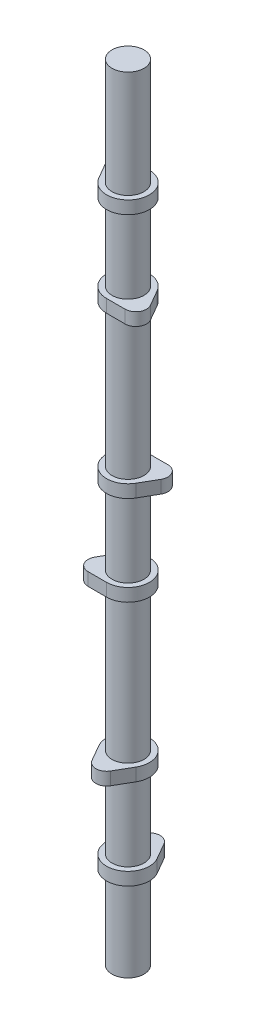
ISO-10303-21;
HEADER;
FILE_DESCRIPTION(('STEP AP214'),'2;1');
FILE_NAME('part.step','',(''),(''),'','','');
FILE_SCHEMA(('AUTOMOTIVE_DESIGN { 1 0 10303 214 1 1 1 1 }'));
ENDSEC;
DATA;
#1=APPLICATION_CONTEXT('core data for automotive mechanical design processes');
#2=APPLICATION_PROTOCOL_DEFINITION('international standard','automotive_design',2000,#1);
#3=PRODUCT_CONTEXT('',#1,'mechanical');
#4=PRODUCT('Part','Part','',(#3));
#5=PRODUCT_RELATED_PRODUCT_CATEGORY('part','',(#4));
#6=PRODUCT_DEFINITION_FORMATION('','',#4);
#7=PRODUCT_DEFINITION_CONTEXT('part definition',#1,'design');
#8=PRODUCT_DEFINITION('design','',#6,#7);
#9=PRODUCT_DEFINITION_SHAPE('','',#8);
#10=(LENGTH_UNIT() NAMED_UNIT(*) SI_UNIT(.MILLI.,.METRE.));
#11=(NAMED_UNIT(*) PLANE_ANGLE_UNIT() SI_UNIT($,.RADIAN.));
#12=(NAMED_UNIT(*) SI_UNIT($,.STERADIAN.) SOLID_ANGLE_UNIT());
#13=UNCERTAINTY_MEASURE_WITH_UNIT(LENGTH_MEASURE(1.E-05),#10,'distance_accuracy_value','');
#14=(GEOMETRIC_REPRESENTATION_CONTEXT(3) GLOBAL_UNCERTAINTY_ASSIGNED_CONTEXT((#13)) GLOBAL_UNIT_ASSIGNED_CONTEXT((#10,
#11,#12)) REPRESENTATION_CONTEXT('',''));
#15=CARTESIAN_POINT('',(0.,0.,0.));
#16=DIRECTION('',(0.,0.,1.));
#17=DIRECTION('',(1.,0.,0.));
#18=AXIS2_PLACEMENT_3D('',#15,#16,#17);
#19=CARTESIAN_POINT('',(0.,416.56,0.));
#20=DIRECTION('',(0.,-1.,0.));
#21=DIRECTION('',(0.,0.,-1.));
#22=AXIS2_PLACEMENT_3D('',#19,#20,#21);
#23=CYLINDRICAL_SURFACE('',#22,9.5);
#24=CARTESIAN_POINT('',(0.,207.01,0.));
#25=DIRECTION('',(0.,1.,0.));
#26=DIRECTION('',(0.,0.,1.));
#27=AXIS2_PLACEMENT_3D('',#24,#25,#26);
#28=CIRCLE('',#27,9.5);
#29=CARTESIAN_POINT('',(0.,207.01,9.5));
#30=VERTEX_POINT('',#29);
#31=EDGE_CURVE('E381',#30,#30,#28,.T.);
#32=ORIENTED_EDGE('',*,*,#31,.T.);
#33=EDGE_LOOP('',(#32));
#34=FACE_BOUND('',#33,.T.);
#35=CARTESIAN_POINT('',(0.,292.1,0.));
#36=DIRECTION('',(0.,1.,0.));
#37=DIRECTION('',(0.,0.,1.));
#38=AXIS2_PLACEMENT_3D('',#35,#36,#37);
#39=CIRCLE('',#38,9.5);
#40=CARTESIAN_POINT('',(0.,292.1,9.5));
#41=VERTEX_POINT('',#40);
#42=EDGE_CURVE('E11',#41,#41,#39,.T.);
#43=ORIENTED_EDGE('',*,*,#42,.F.);
#44=EDGE_LOOP('',(#43));
#45=FACE_BOUND('',#44,.T.);
#46=ADVANCED_FACE('F43',(#34,#45),#23,.T.);
#47=CARTESIAN_POINT('',(0.,60.96,0.));
#48=DIRECTION('',(0.,1.,0.));
#49=DIRECTION('',(0.,0.,1.));
#50=AXIS2_PLACEMENT_3D('',#47,#48,#49);
#51=CIRCLE('',#50,9.5);
#52=CARTESIAN_POINT('',(0.,60.96,9.5));
#53=VERTEX_POINT('',#52);
#54=EDGE_CURVE('E424',#53,#53,#51,.T.);
#55=ORIENTED_EDGE('',*,*,#54,.T.);
#56=EDGE_LOOP('',(#55));
#57=FACE_BOUND('',#56,.T.);
#58=CARTESIAN_POINT('',(0.,146.05,0.));
#59=DIRECTION('',(0.,1.,0.));
#60=DIRECTION('',(0.,0.,1.));
#61=AXIS2_PLACEMENT_3D('',#58,#59,#60);
#62=CIRCLE('',#61,9.5);
#63=CARTESIAN_POINT('',(0.,146.05,9.5));
#64=VERTEX_POINT('',#63);
#65=EDGE_CURVE('E485',#64,#64,#62,.T.);
#66=ORIENTED_EDGE('',*,*,#65,.F.);
#67=EDGE_LOOP('',(#66));
#68=FACE_BOUND('',#67,.T.);
#69=ADVANCED_FACE('F539',(#57,#68),#23,.T.);
#70=CARTESIAN_POINT('',(0.,7.62000000000002,0.));
#71=DIRECTION('',(0.,1.,0.));
#72=DIRECTION('',(0.,0.,1.));
#73=AXIS2_PLACEMENT_3D('',#70,#71,#72);
#74=CIRCLE('',#73,9.5);
#75=CARTESIAN_POINT('',(0.,7.62000000000002,9.5));
#76=VERTEX_POINT('',#75);
#77=EDGE_CURVE('E429',#76,#76,#74,.F.);
#78=ORIENTED_EDGE('',*,*,#77,.F.);
#79=EDGE_LOOP('',(#78));
#80=FACE_BOUND('',#79,.T.);
#81=CARTESIAN_POINT('',(0.,53.34,0.));
#82=DIRECTION('',(0.,1.,0.));
#83=DIRECTION('',(0.,0.,1.));
#84=AXIS2_PLACEMENT_3D('',#81,#82,#83);
#85=CIRCLE('',#84,9.5);
#86=CARTESIAN_POINT('',(0.,53.34,9.5));
#87=VERTEX_POINT('',#86);
#88=EDGE_CURVE('E474',#87,#87,#85,.T.);
#89=ORIENTED_EDGE('',*,*,#88,.F.);
#90=EDGE_LOOP('',(#89));
#91=FACE_BOUND('',#90,.T.);
#92=ADVANCED_FACE('F547',(#80,#91),#23,.T.);
#93=CARTESIAN_POINT('',(0.,7.62,-12.7));
#94=DIRECTION('',(0.,-1.,0.));
#95=DIRECTION('',(0.,0.,-1.));
#96=AXIS2_PLACEMENT_3D('',#93,#94,#95);
#97=CYLINDRICAL_SURFACE('',#96,6.35);
#98=CARTESIAN_POINT('',(0.,0.,-12.7));
#99=DIRECTION('',(0.,1.,0.));
#100=DIRECTION('',(0.,0.,1.));
#101=AXIS2_PLACEMENT_3D('',#98,#99,#100);
#102=CIRCLE('',#101,6.35);
#103=CARTESIAN_POINT('',(5.49926131403118,0.,-15.875));
#104=VERTEX_POINT('',#103);
#105=CARTESIAN_POINT('',(-5.49926131403118,0.,-15.875));
#106=VERTEX_POINT('',#105);
#107=EDGE_CURVE('E437',#104,#106,#102,.T.);
#108=ORIENTED_EDGE('',*,*,#107,.T.);
#109=DIRECTION('',(0.,-1.,0.));
#110=VECTOR('',#109,1.);
#111=CARTESIAN_POINT('',(-5.49926131403118,7.62,-15.875));
#112=LINE('',#111,#110);
#113=CARTESIAN_POINT('',(-5.49926131403118,7.62,-15.875));
#114=VERTEX_POINT('',#113);
#115=EDGE_CURVE('E467',#114,#106,#112,.T.);
#116=ORIENTED_EDGE('',*,*,#115,.F.);
#117=CARTESIAN_POINT('',(0.,7.62,-12.7));
#118=DIRECTION('',(0.,1.,0.));
#119=DIRECTION('',(0.,0.,1.));
#120=AXIS2_PLACEMENT_3D('',#117,#118,#119);
#121=CIRCLE('',#120,6.35);
#122=CARTESIAN_POINT('',(5.49926131403118,7.62,-15.875));
#123=VERTEX_POINT('',#122);
#124=EDGE_CURVE('E438',#123,#114,#121,.T.);
#125=ORIENTED_EDGE('',*,*,#124,.F.);
#126=DIRECTION('',(0.,-1.,0.));
#127=VECTOR('',#126,1.);
#128=CARTESIAN_POINT('',(5.49926131403118,7.62,-15.875));
#129=LINE('',#128,#127);
#130=EDGE_CURVE('E448',#123,#104,#129,.T.);
#131=ORIENTED_EDGE('',*,*,#130,.T.);
#132=EDGE_LOOP('',(#108,#116,#125,#131));
#133=FACE_BOUND('',#132,.T.);
#134=ADVANCED_FACE('F45',(#133),#97,.T.);
#135=CARTESIAN_POINT('',(-5.49926131403118,7.62,-15.875));
#136=DIRECTION('',(0.866025403784438,0.,0.5));
#137=DIRECTION('',(0.5,0.,-0.866025403784439));
#138=AXIS2_PLACEMENT_3D('',#135,#136,#137);
#139=PLANE('',#138);
#140=DIRECTION('',(-0.5,0.,0.866025403784438));
#141=VECTOR('',#140,1.);
#142=CARTESIAN_POINT('',(-5.49926131403118,0.,-15.875));
#143=LINE('',#142,#141);
#144=CARTESIAN_POINT('',(-10.9985226280624,0.,-6.35));
#145=VERTEX_POINT('',#144);
#146=EDGE_CURVE('E452',#106,#145,#143,.T.);
#147=ORIENTED_EDGE('',*,*,#146,.T.);
#148=DIRECTION('',(0.,-1.,0.));
#149=VECTOR('',#148,1.);
#150=CARTESIAN_POINT('',(-10.9985226280624,7.62,-6.35));
#151=LINE('',#150,#149);
#152=CARTESIAN_POINT('',(-10.9985226280624,7.62,-6.35));
#153=VERTEX_POINT('',#152);
#154=EDGE_CURVE('E464',#153,#145,#151,.T.);
#155=ORIENTED_EDGE('',*,*,#154,.F.);
#156=DIRECTION('',(-0.5,0.,0.866025403784438));
#157=VECTOR('',#156,1.);
#158=CARTESIAN_POINT('',(-5.49926131403118,7.62,-15.875));
#159=LINE('',#158,#157);
#160=EDGE_CURVE('E94',#114,#153,#159,.T.);
#161=ORIENTED_EDGE('',*,*,#160,.F.);
#162=ORIENTED_EDGE('',*,*,#115,.T.);
#163=EDGE_LOOP('',(#147,#155,#161,#162));
#164=FACE_BOUND('',#163,.T.);
#165=ADVANCED_FACE('F581',(#164),#139,.F.);
#166=CARTESIAN_POINT('',(0.,7.62,0.));
#167=DIRECTION('',(0.,-1.,0.));
#168=DIRECTION('',(0.,0.,-1.));
#169=AXIS2_PLACEMENT_3D('',#166,#167,#168);
#170=CYLINDRICAL_SURFACE('',#169,12.7);
#171=CARTESIAN_POINT('',(0.,0.,0.));
#172=DIRECTION('',(0.,1.,0.));
#173=DIRECTION('',(0.,0.,1.));
#174=AXIS2_PLACEMENT_3D('',#171,#172,#173);
#175=CIRCLE('',#174,12.7);
#176=CARTESIAN_POINT('',(10.9985226280624,0.,-6.35000000000001));
#177=VERTEX_POINT('',#176);
#178=EDGE_CURVE('E80',#145,#177,#175,.T.);
#179=ORIENTED_EDGE('',*,*,#178,.T.);
#180=DIRECTION('',(0.,-1.,0.));
#181=VECTOR('',#180,1.);
#182=CARTESIAN_POINT('',(10.9985226280624,7.62,-6.35000000000001));
#183=LINE('',#182,#181);
#184=CARTESIAN_POINT('',(10.9985226280624,7.62,-6.35000000000001));
#185=VERTEX_POINT('',#184);
#186=EDGE_CURVE('E461',#185,#177,#183,.T.);
#187=ORIENTED_EDGE('',*,*,#186,.F.);
#188=CARTESIAN_POINT('',(0.,7.62,0.));
#189=DIRECTION('',(0.,1.,0.));
#190=DIRECTION('',(0.,0.,1.));
#191=AXIS2_PLACEMENT_3D('',#188,#189,#190);
#192=CIRCLE('',#191,12.7);
#193=EDGE_CURVE('E443',#153,#185,#192,.T.);
#194=ORIENTED_EDGE('',*,*,#193,.F.);
#195=ORIENTED_EDGE('',*,*,#154,.T.);
#196=EDGE_LOOP('',(#179,#187,#194,#195));
#197=FACE_BOUND('',#196,.T.);
#198=ADVANCED_FACE('F1023',(#197),#170,.T.);
#199=CARTESIAN_POINT('',(5.49926131403118,7.62,-15.875));
#200=DIRECTION('',(-0.866025403784438,0.,0.5));
#201=DIRECTION('',(0.5,0.,0.866025403784439));
#202=AXIS2_PLACEMENT_3D('',#199,#200,#201);
#203=PLANE('',#202);
#204=DIRECTION('',(-0.5,0.,-0.866025403784439));
#205=VECTOR('',#204,1.);
#206=CARTESIAN_POINT('',(5.49926131403118,0.,-15.875));
#207=LINE('',#206,#205);
#208=EDGE_CURVE('E86',#177,#104,#207,.T.);
#209=ORIENTED_EDGE('',*,*,#208,.T.);
#210=ORIENTED_EDGE('',*,*,#130,.F.);
#211=DIRECTION('',(-0.5,0.,-0.866025403784439));
#212=VECTOR('',#211,1.);
#213=CARTESIAN_POINT('',(5.49926131403118,7.62,-15.875));
#214=LINE('',#213,#212);
#215=EDGE_CURVE('E62',#185,#123,#214,.T.);
#216=ORIENTED_EDGE('',*,*,#215,.F.);
#217=ORIENTED_EDGE('',*,*,#186,.T.);
#218=EDGE_LOOP('',(#209,#210,#216,#217));
#219=FACE_BOUND('',#218,.T.);
#220=ADVANCED_FACE('F1014',(#219),#203,.F.);
#221=CARTESIAN_POINT('',(0.,7.62,-12.7));
#222=DIRECTION('',(0.,1.,0.));
#223=DIRECTION('',(0.,0.,1.));
#224=AXIS2_PLACEMENT_3D('',#221,#222,#223);
#225=PLANE('',#224);
#226=ORIENTED_EDGE('',*,*,#77,.T.);
#227=EDGE_LOOP('',(#226));
#228=FACE_BOUND('',#227,.T.);
#229=ORIENTED_EDGE('',*,*,#124,.T.);
#230=ORIENTED_EDGE('',*,*,#160,.T.);
#231=ORIENTED_EDGE('',*,*,#193,.T.);
#232=ORIENTED_EDGE('',*,*,#215,.T.);
#233=EDGE_LOOP('',(#229,#230,#231,#232));
#234=FACE_BOUND('',#233,.T.);
#235=ADVANCED_FACE('F1004',(#228,#234),#225,.T.);
#236=CARTESIAN_POINT('',(0.,0.,-12.7));
#237=DIRECTION('',(0.,1.,0.));
#238=DIRECTION('',(0.,0.,1.));
#239=AXIS2_PLACEMENT_3D('',#236,#237,#238);
#240=PLANE('',#239);
#241=CARTESIAN_POINT('',(0.,0.,0.));
#242=DIRECTION('',(0.,1.,0.));
#243=DIRECTION('',(0.,0.,1.));
#244=AXIS2_PLACEMENT_3D('',#241,#242,#243);
#245=CIRCLE('',#244,9.5);
#246=CARTESIAN_POINT('',(0.,0.,9.5));
#247=VERTEX_POINT('',#246);
#248=EDGE_CURVE('E470',#247,#247,#245,.F.);
#249=ORIENTED_EDGE('',*,*,#248,.F.);
#250=EDGE_LOOP('',(#249));
#251=FACE_BOUND('',#250,.T.);
#252=ORIENTED_EDGE('',*,*,#107,.F.);
#253=ORIENTED_EDGE('',*,*,#208,.F.);
#254=ORIENTED_EDGE('',*,*,#178,.F.);
#255=ORIENTED_EDGE('',*,*,#146,.F.);
#256=EDGE_LOOP('',(#252,#253,#254,#255));
#257=FACE_BOUND('',#256,.T.);
#258=ADVANCED_FACE('F573',(#251,#257),#240,.F.);
#259=CARTESIAN_POINT('',(0.,-49.53,0.));
#260=DIRECTION('',(0.,1.,0.));
#261=DIRECTION('',(0.,0.,1.));
#262=AXIS2_PLACEMENT_3D('',#259,#260,#261);
#263=PLANE('',#262);
#264=CARTESIAN_POINT('',(0.,-49.53,0.));
#265=DIRECTION('',(0.,1.,0.));
#266=DIRECTION('',(0.,0.,1.));
#267=AXIS2_PLACEMENT_3D('',#264,#265,#266);
#268=CIRCLE('',#267,9.5);
#269=CARTESIAN_POINT('',(0.,-49.53,9.5));
#270=VERTEX_POINT('',#269);
#271=EDGE_CURVE('E430',#270,#270,#268,.T.);
#272=ORIENTED_EDGE('',*,*,#271,.F.);
#273=EDGE_LOOP('',(#272));
#274=FACE_BOUND('',#273,.T.);
#275=ADVANCED_FACE('F564',(#274),#263,.F.);
#276=ORIENTED_EDGE('',*,*,#271,.T.);
#277=EDGE_LOOP('',(#276));
#278=FACE_BOUND('',#277,.T.);
#279=ORIENTED_EDGE('',*,*,#248,.T.);
#280=EDGE_LOOP('',(#279));
#281=FACE_BOUND('',#280,.T.);
#282=ADVANCED_FACE('F555',(#278,#281),#23,.T.);
#283=CARTESIAN_POINT('',(0.,60.96,12.7));
#284=DIRECTION('',(0.,-1.,0.));
#285=DIRECTION('',(0.,0.,1.));
#286=AXIS2_PLACEMENT_3D('',#283,#284,#285);
#287=CYLINDRICAL_SURFACE('',#286,6.35);
#288=CARTESIAN_POINT('',(0.,53.34,12.7));
#289=DIRECTION('',(0.,1.,0.));
#290=DIRECTION('',(0.,0.,-1.));
#291=AXIS2_PLACEMENT_3D('',#288,#289,#290);
#292=CIRCLE('',#291,6.35);
#293=CARTESIAN_POINT('',(-5.4992613140313,53.34,15.875));
#294=VERTEX_POINT('',#293);
#295=CARTESIAN_POINT('',(5.49926131403107,53.34,15.875));
#296=VERTEX_POINT('',#295);
#297=EDGE_CURVE('E397',#294,#296,#292,.T.);
#298=ORIENTED_EDGE('',*,*,#297,.T.);
#299=DIRECTION('',(0.,-1.,0.));
#300=VECTOR('',#299,1.);
#301=CARTESIAN_POINT('',(5.49926131403107,60.96,15.875));
#302=LINE('',#301,#300);
#303=CARTESIAN_POINT('',(5.49926131403107,60.96,15.875));
#304=VERTEX_POINT('',#303);
#305=EDGE_CURVE('E420',#304,#296,#302,.T.);
#306=ORIENTED_EDGE('',*,*,#305,.F.);
#307=CARTESIAN_POINT('',(0.,60.96,12.7));
#308=DIRECTION('',(0.,1.,0.));
#309=DIRECTION('',(0.,0.,-1.));
#310=AXIS2_PLACEMENT_3D('',#307,#308,#309);
#311=CIRCLE('',#310,6.35);
#312=CARTESIAN_POINT('',(-5.4992613140313,60.96,15.875));
#313=VERTEX_POINT('',#312);
#314=EDGE_CURVE('E382',#313,#304,#311,.T.);
#315=ORIENTED_EDGE('',*,*,#314,.F.);
#316=DIRECTION('',(0.,-1.,0.));
#317=VECTOR('',#316,1.);
#318=CARTESIAN_POINT('',(-5.4992613140313,60.96,15.875));
#319=LINE('',#318,#317);
#320=EDGE_CURVE('E396',#313,#294,#319,.T.);
#321=ORIENTED_EDGE('',*,*,#320,.T.);
#322=EDGE_LOOP('',(#298,#306,#315,#321));
#323=FACE_BOUND('',#322,.T.);
#324=ADVANCED_FACE('F563',(#323),#287,.T.);
#325=CARTESIAN_POINT('',(5.49926131403107,60.96,15.875));
#326=DIRECTION('',(-0.866025403784435,0.,-0.500000000000006));
#327=DIRECTION('',(-0.500000000000006,0.,0.866025403784435));
#328=AXIS2_PLACEMENT_3D('',#325,#326,#327);
#329=PLANE('',#328);
#330=DIRECTION('',(0.500000000000006,0.,-0.866025403784435));
#331=VECTOR('',#330,1.);
#332=CARTESIAN_POINT('',(5.49926131403107,53.34,15.875));
#333=LINE('',#332,#331);
#334=CARTESIAN_POINT('',(10.9985226280623,53.34,6.35000000000008));
#335=VERTEX_POINT('',#334);
#336=EDGE_CURVE('E401',#296,#335,#333,.T.);
#337=ORIENTED_EDGE('',*,*,#336,.T.);
#338=DIRECTION('',(0.,-1.,0.));
#339=VECTOR('',#338,1.);
#340=CARTESIAN_POINT('',(10.9985226280623,60.96,6.35000000000008));
#341=LINE('',#340,#339);
#342=CARTESIAN_POINT('',(10.9985226280623,60.96,6.35000000000008));
#343=VERTEX_POINT('',#342);
#344=EDGE_CURVE('E416',#343,#335,#341,.T.);
#345=ORIENTED_EDGE('',*,*,#344,.F.);
#346=DIRECTION('',(0.500000000000006,0.,-0.866025403784435));
#347=VECTOR('',#346,1.);
#348=CARTESIAN_POINT('',(5.49926131403107,60.96,15.875));
#349=LINE('',#348,#347);
#350=EDGE_CURVE('E386',#304,#343,#349,.T.);
#351=ORIENTED_EDGE('',*,*,#350,.F.);
#352=ORIENTED_EDGE('',*,*,#305,.T.);
#353=EDGE_LOOP('',(#337,#345,#351,#352));
#354=FACE_BOUND('',#353,.T.);
#355=ADVANCED_FACE('F570',(#354),#329,.F.);
#356=CARTESIAN_POINT('',(0.,60.96,0.));
#357=DIRECTION('',(0.,-1.,0.));
#358=DIRECTION('',(0.,0.,1.));
#359=AXIS2_PLACEMENT_3D('',#356,#357,#358);
#360=CYLINDRICAL_SURFACE('',#359,12.7);
#361=CARTESIAN_POINT('',(0.,53.34,0.));
#362=DIRECTION('',(0.,1.,0.));
#363=DIRECTION('',(0.,0.,-1.));
#364=AXIS2_PLACEMENT_3D('',#361,#362,#363);
#365=CIRCLE('',#364,12.7);
#366=CARTESIAN_POINT('',(-10.9985226280624,53.34,6.34999999999994));
#367=VERTEX_POINT('',#366);
#368=EDGE_CURVE('E404',#335,#367,#365,.T.);
#369=ORIENTED_EDGE('',*,*,#368,.T.);
#370=DIRECTION('',(0.,-1.,0.));
#371=VECTOR('',#370,1.);
#372=CARTESIAN_POINT('',(-10.9985226280624,60.96,6.34999999999994));
#373=LINE('',#372,#371);
#374=CARTESIAN_POINT('',(-10.9985226280624,60.96,6.34999999999994));
#375=VERTEX_POINT('',#374);
#376=EDGE_CURVE('E412',#375,#367,#373,.T.);
#377=ORIENTED_EDGE('',*,*,#376,.F.);
#378=CARTESIAN_POINT('',(0.,60.96,0.));
#379=DIRECTION('',(0.,1.,0.));
#380=DIRECTION('',(0.,0.,-1.));
#381=AXIS2_PLACEMENT_3D('',#378,#379,#380);
#382=CIRCLE('',#381,12.7);
#383=EDGE_CURVE('E390',#343,#375,#382,.T.);
#384=ORIENTED_EDGE('',*,*,#383,.F.);
#385=ORIENTED_EDGE('',*,*,#344,.T.);
#386=EDGE_LOOP('',(#369,#377,#384,#385));
#387=FACE_BOUND('',#386,.T.);
#388=ADVANCED_FACE('F653',(#387),#360,.T.);
#389=CARTESIAN_POINT('',(-5.4992613140313,60.96,15.875));
#390=DIRECTION('',(0.866025403784442,0.,-0.499999999999994));
#391=DIRECTION('',(-0.499999999999994,0.,-0.866025403784442));
#392=AXIS2_PLACEMENT_3D('',#389,#390,#391);
#393=PLANE('',#392);
#394=DIRECTION('',(0.499999999999994,0.,0.866025403784442));
#395=VECTOR('',#394,1.);
#396=CARTESIAN_POINT('',(-5.4992613140313,53.34,15.875));
#397=LINE('',#396,#395);
#398=EDGE_CURVE('E387',#367,#294,#397,.T.);
#399=ORIENTED_EDGE('',*,*,#398,.T.);
#400=ORIENTED_EDGE('',*,*,#320,.F.);
#401=DIRECTION('',(0.499999999999994,0.,0.866025403784442));
#402=VECTOR('',#401,1.);
#403=CARTESIAN_POINT('',(-5.4992613140313,60.96,15.875));
#404=LINE('',#403,#402);
#405=EDGE_CURVE('E393',#375,#313,#404,.T.);
#406=ORIENTED_EDGE('',*,*,#405,.F.);
#407=ORIENTED_EDGE('',*,*,#376,.T.);
#408=EDGE_LOOP('',(#399,#400,#406,#407));
#409=FACE_BOUND('',#408,.T.);
#410=ADVANCED_FACE('F646',(#409),#393,.F.);
#411=CARTESIAN_POINT('',(0.,60.96,12.7));
#412=DIRECTION('',(0.,1.,0.));
#413=DIRECTION('',(0.,0.,-1.));
#414=AXIS2_PLACEMENT_3D('',#411,#412,#413);
#415=PLANE('',#414);
#416=ORIENTED_EDGE('',*,*,#54,.F.);
#417=EDGE_LOOP('',(#416));
#418=FACE_BOUND('',#417,.T.);
#419=ORIENTED_EDGE('',*,*,#314,.T.);
#420=ORIENTED_EDGE('',*,*,#350,.T.);
#421=ORIENTED_EDGE('',*,*,#383,.T.);
#422=ORIENTED_EDGE('',*,*,#405,.T.);
#423=EDGE_LOOP('',(#419,#420,#421,#422));
#424=FACE_BOUND('',#423,.T.);
#425=ADVANCED_FACE('F642',(#418,#424),#415,.T.);
#426=CARTESIAN_POINT('',(0.,53.34,12.7));
#427=DIRECTION('',(0.,1.,0.));
#428=DIRECTION('',(0.,0.,-1.));
#429=AXIS2_PLACEMENT_3D('',#426,#427,#428);
#430=PLANE('',#429);
#431=ORIENTED_EDGE('',*,*,#88,.T.);
#432=EDGE_LOOP('',(#431));
#433=FACE_BOUND('',#432,.T.);
#434=ORIENTED_EDGE('',*,*,#297,.F.);
#435=ORIENTED_EDGE('',*,*,#398,.F.);
#436=ORIENTED_EDGE('',*,*,#368,.F.);
#437=ORIENTED_EDGE('',*,*,#336,.F.);
#438=EDGE_LOOP('',(#434,#435,#436,#437));
#439=FACE_BOUND('',#438,.T.);
#440=ADVANCED_FACE('F645',(#433,#439),#430,.F.);
#441=CARTESIAN_POINT('',(-10.9985226280623,153.67,6.35000000000005));
#442=DIRECTION('',(0.,-1.,0.));
#443=DIRECTION('',(-0.866025403784436,0.,0.500000000000004));
#444=AXIS2_PLACEMENT_3D('',#441,#442,#443);
#445=CYLINDRICAL_SURFACE('',#444,6.35);
#446=CARTESIAN_POINT('',(-10.9985226280623,146.05,6.35000000000005));
#447=DIRECTION('',(0.,1.,0.));
#448=DIRECTION('',(0.866025403784436,0.,-0.500000000000004));
#449=AXIS2_PLACEMENT_3D('',#446,#447,#448);
#450=CIRCLE('',#449,6.35);
#451=CARTESIAN_POINT('',(-16.4977839420935,146.05,3.17500000000008));
#452=VERTEX_POINT('',#451);
#453=CARTESIAN_POINT('',(-10.9985226280623,146.05,12.7000000000001));
#454=VERTEX_POINT('',#453);
#455=EDGE_CURVE('E311',#452,#454,#450,.T.);
#456=ORIENTED_EDGE('',*,*,#455,.T.);
#457=DIRECTION('',(0.,-1.,0.));
#458=VECTOR('',#457,1.);
#459=CARTESIAN_POINT('',(-10.9985226280623,153.67,12.7000000000001));
#460=LINE('',#459,#458);
#461=CARTESIAN_POINT('',(-10.9985226280623,153.67,12.7000000000001));
#462=VERTEX_POINT('',#461);
#463=EDGE_CURVE('E334',#462,#454,#460,.T.);
#464=ORIENTED_EDGE('',*,*,#463,.F.);
#465=CARTESIAN_POINT('',(-10.9985226280623,153.67,6.35000000000005));
#466=DIRECTION('',(0.,1.,0.));
#467=DIRECTION('',(0.866025403784436,0.,-0.500000000000004));
#468=AXIS2_PLACEMENT_3D('',#465,#466,#467);
#469=CIRCLE('',#468,6.35);
#470=CARTESIAN_POINT('',(-16.4977839420935,153.67,3.17500000000008));
#471=VERTEX_POINT('',#470);
#472=EDGE_CURVE('E296',#471,#462,#469,.T.);
#473=ORIENTED_EDGE('',*,*,#472,.F.);
#474=DIRECTION('',(0.,-1.,0.));
#475=VECTOR('',#474,1.);
#476=CARTESIAN_POINT('',(-16.4977839420935,153.67,3.17500000000008));
#477=LINE('',#476,#475);
#478=EDGE_CURVE('E310',#471,#452,#477,.T.);
#479=ORIENTED_EDGE('',*,*,#478,.T.);
#480=EDGE_LOOP('',(#456,#464,#473,#479));
#481=FACE_BOUND('',#480,.T.);
#482=ADVANCED_FACE('F633',(#481),#445,.T.);
#483=CARTESIAN_POINT('',(-10.9985226280623,153.67,12.7000000000001));
#484=DIRECTION('',(0.,0.,-1.));
#485=DIRECTION('',(-1.,0.,0.));
#486=AXIS2_PLACEMENT_3D('',#483,#484,#485);
#487=PLANE('',#486);
#488=DIRECTION('',(1.,0.,0.));
#489=VECTOR('',#488,1.);
#490=CARTESIAN_POINT('',(-10.9985226280623,146.05,12.7000000000001));
#491=LINE('',#490,#489);
#492=CARTESIAN_POINT('',(0.,146.05,12.7));
#493=VERTEX_POINT('',#492);
#494=EDGE_CURVE('E315',#454,#493,#491,.T.);
#495=ORIENTED_EDGE('',*,*,#494,.T.);
#496=DIRECTION('',(0.,-1.,0.));
#497=VECTOR('',#496,1.);
#498=CARTESIAN_POINT('',(0.,153.67,12.7));
#499=LINE('',#498,#497);
#500=CARTESIAN_POINT('',(0.,153.67,12.7));
#501=VERTEX_POINT('',#500);
#502=EDGE_CURVE('E330',#501,#493,#499,.T.);
#503=ORIENTED_EDGE('',*,*,#502,.F.);
#504=DIRECTION('',(1.,0.,0.));
#505=VECTOR('',#504,1.);
#506=CARTESIAN_POINT('',(-10.9985226280623,153.67,12.7000000000001));
#507=LINE('',#506,#505);
#508=EDGE_CURVE('E300',#462,#501,#507,.T.);
#509=ORIENTED_EDGE('',*,*,#508,.F.);
#510=ORIENTED_EDGE('',*,*,#463,.T.);
#511=EDGE_LOOP('',(#495,#503,#509,#510));
#512=FACE_BOUND('',#511,.T.);
#513=ADVANCED_FACE('F698',(#512),#487,.F.);
#514=CARTESIAN_POINT('',(0.,153.67,0.));
#515=DIRECTION('',(0.,-1.,0.));
#516=DIRECTION('',(-0.866025403784436,0.,0.500000000000004));
#517=AXIS2_PLACEMENT_3D('',#514,#515,#516);
#518=CYLINDRICAL_SURFACE('',#517,12.7);
#519=CARTESIAN_POINT('',(0.,146.05,0.));
#520=DIRECTION('',(0.,1.,0.));
#521=DIRECTION('',(0.866025403784436,0.,-0.500000000000004));
#522=AXIS2_PLACEMENT_3D('',#519,#520,#521);
#523=CIRCLE('',#522,12.7);
#524=CARTESIAN_POINT('',(-10.9985226280624,146.05,-6.34999999999994));
#525=VERTEX_POINT('',#524);
#526=EDGE_CURVE('E318',#493,#525,#523,.T.);
#527=ORIENTED_EDGE('',*,*,#526,.T.);
#528=DIRECTION('',(0.,-1.,0.));
#529=VECTOR('',#528,1.);
#530=CARTESIAN_POINT('',(-10.9985226280624,153.67,-6.34999999999994));
#531=LINE('',#530,#529);
#532=CARTESIAN_POINT('',(-10.9985226280624,153.67,-6.34999999999994));
#533=VERTEX_POINT('',#532);
#534=EDGE_CURVE('E326',#533,#525,#531,.T.);
#535=ORIENTED_EDGE('',*,*,#534,.F.);
#536=CARTESIAN_POINT('',(0.,153.67,0.));
#537=DIRECTION('',(0.,1.,0.));
#538=DIRECTION('',(0.866025403784436,0.,-0.500000000000004));
#539=AXIS2_PLACEMENT_3D('',#536,#537,#538);
#540=CIRCLE('',#539,12.7);
#541=EDGE_CURVE('E304',#501,#533,#540,.T.);
#542=ORIENTED_EDGE('',*,*,#541,.F.);
#543=ORIENTED_EDGE('',*,*,#502,.T.);
#544=EDGE_LOOP('',(#527,#535,#542,#543));
#545=FACE_BOUND('',#544,.T.);
#546=ADVANCED_FACE('F705',(#545),#518,.T.);
#547=CARTESIAN_POINT('',(-16.4977839420935,153.67,3.17500000000008));
#548=DIRECTION('',(0.866025403784441,0.,0.499999999999996));
#549=DIRECTION('',(0.499999999999996,0.,-0.866025403784441));
#550=AXIS2_PLACEMENT_3D('',#547,#548,#549);
#551=PLANE('',#550);
#552=DIRECTION('',(-0.499999999999996,0.,0.866025403784441));
#553=VECTOR('',#552,1.);
#554=CARTESIAN_POINT('',(-16.4977839420935,146.05,3.17500000000008));
#555=LINE('',#554,#553);
#556=EDGE_CURVE('E301',#525,#452,#555,.T.);
#557=ORIENTED_EDGE('',*,*,#556,.T.);
#558=ORIENTED_EDGE('',*,*,#478,.F.);
#559=DIRECTION('',(-0.499999999999996,0.,0.866025403784441));
#560=VECTOR('',#559,1.);
#561=CARTESIAN_POINT('',(-16.4977839420935,153.67,3.17500000000008));
#562=LINE('',#561,#560);
#563=EDGE_CURVE('E307',#533,#471,#562,.T.);
#564=ORIENTED_EDGE('',*,*,#563,.F.);
#565=ORIENTED_EDGE('',*,*,#534,.T.);
#566=EDGE_LOOP('',(#557,#558,#564,#565));
#567=FACE_BOUND('',#566,.T.);
#568=ADVANCED_FACE('F712',(#567),#551,.F.);
#569=CARTESIAN_POINT('',(-10.9985226280623,153.67,6.35000000000005));
#570=DIRECTION('',(0.,1.,0.));
#571=DIRECTION('',(0.866025403784436,0.,-0.500000000000004));
#572=AXIS2_PLACEMENT_3D('',#569,#570,#571);
#573=PLANE('',#572);
#574=CARTESIAN_POINT('',(0.,153.67,0.));
#575=DIRECTION('',(0.,1.,0.));
#576=DIRECTION('',(0.,0.,1.));
#577=AXIS2_PLACEMENT_3D('',#574,#575,#576);
#578=CIRCLE('',#577,9.5);
#579=CARTESIAN_POINT('',(0.,153.67,9.5));
#580=VERTEX_POINT('',#579);
#581=EDGE_CURVE('E338',#580,#580,#578,.T.);
#582=ORIENTED_EDGE('',*,*,#581,.F.);
#583=EDGE_LOOP('',(#582));
#584=FACE_BOUND('',#583,.T.);
#585=ORIENTED_EDGE('',*,*,#472,.T.);
#586=ORIENTED_EDGE('',*,*,#508,.T.);
#587=ORIENTED_EDGE('',*,*,#541,.T.);
#588=ORIENTED_EDGE('',*,*,#563,.T.);
#589=EDGE_LOOP('',(#585,#586,#587,#588));
#590=FACE_BOUND('',#589,.T.);
#591=ADVANCED_FACE('F628',(#584,#590),#573,.T.);
#592=CARTESIAN_POINT('',(-10.9985226280623,146.05,6.35000000000005));
#593=DIRECTION('',(0.,1.,0.));
#594=DIRECTION('',(0.866025403784436,0.,-0.500000000000004));
#595=AXIS2_PLACEMENT_3D('',#592,#593,#594);
#596=PLANE('',#595);
#597=ORIENTED_EDGE('',*,*,#65,.T.);
#598=EDGE_LOOP('',(#597));
#599=FACE_BOUND('',#598,.T.);
#600=ORIENTED_EDGE('',*,*,#455,.F.);
#601=ORIENTED_EDGE('',*,*,#556,.F.);
#602=ORIENTED_EDGE('',*,*,#526,.F.);
#603=ORIENTED_EDGE('',*,*,#494,.F.);
#604=EDGE_LOOP('',(#600,#601,#602,#603));
#605=FACE_BOUND('',#604,.T.);
#606=ADVANCED_FACE('F620',(#599,#605),#596,.F.);
#607=CARTESIAN_POINT('',(10.9985226280624,207.01,-6.34999999999997));
#608=DIRECTION('',(0.,1.,0.));
#609=DIRECTION('',(-0.86602540378444,0.,0.499999999999998));
#610=AXIS2_PLACEMENT_3D('',#607,#608,#609);
#611=PLANE('',#610);
#612=ORIENTED_EDGE('',*,*,#31,.F.);
#613=EDGE_LOOP('',(#612));
#614=FACE_BOUND('',#613,.T.);
#615=CARTESIAN_POINT('',(10.9985226280624,207.01,-6.34999999999997));
#616=DIRECTION('',(0.,1.,0.));
#617=DIRECTION('',(-0.86602540378444,0.,0.499999999999998));
#618=AXIS2_PLACEMENT_3D('',#615,#616,#617);
#619=CIRCLE('',#618,6.35);
#620=CARTESIAN_POINT('',(16.4977839420936,207.01,-3.17499999999996));
#621=VERTEX_POINT('',#620);
#622=CARTESIAN_POINT('',(10.9985226280624,207.01,-12.7));
#623=VERTEX_POINT('',#622);
#624=EDGE_CURVE('E339',#621,#623,#619,.T.);
#625=ORIENTED_EDGE('',*,*,#624,.T.);
#626=DIRECTION('',(-1.,0.,0.));
#627=VECTOR('',#626,1.);
#628=CARTESIAN_POINT('',(10.9985226280624,207.01,-12.7));
#629=LINE('',#628,#627);
#630=CARTESIAN_POINT('',(0.,207.01,-12.7));
#631=VERTEX_POINT('',#630);
#632=EDGE_CURVE('E343',#623,#631,#629,.T.);
#633=ORIENTED_EDGE('',*,*,#632,.T.);
#634=CARTESIAN_POINT('',(0.,207.01,0.));
#635=DIRECTION('',(0.,1.,0.));
#636=DIRECTION('',(-0.86602540378444,0.,0.499999999999998));
#637=AXIS2_PLACEMENT_3D('',#634,#635,#636);
#638=CIRCLE('',#637,12.7);
#639=CARTESIAN_POINT('',(10.9985226280624,207.01,6.35000000000001));
#640=VERTEX_POINT('',#639);
#641=EDGE_CURVE('E347',#631,#640,#638,.T.);
#642=ORIENTED_EDGE('',*,*,#641,.T.);
#643=DIRECTION('',(0.500000000000002,0.,-0.866025403784438));
#644=VECTOR('',#643,1.);
#645=CARTESIAN_POINT('',(16.4977839420936,207.01,-3.17499999999996));
#646=LINE('',#645,#644);
#647=EDGE_CURVE('E350',#640,#621,#646,.T.);
#648=ORIENTED_EDGE('',*,*,#647,.T.);
#649=EDGE_LOOP('',(#625,#633,#642,#648));
#650=FACE_BOUND('',#649,.T.);
#651=ADVANCED_FACE('F618',(#614,#650),#611,.T.);
#652=CARTESIAN_POINT('',(10.9985226280624,207.01,-12.7));
#653=DIRECTION('',(0.,0.,1.));
#654=DIRECTION('',(1.,0.,0.));
#655=AXIS2_PLACEMENT_3D('',#652,#653,#654);
#656=PLANE('',#655);
#657=DIRECTION('',(-1.,0.,0.));
#658=VECTOR('',#657,1.);
#659=CARTESIAN_POINT('',(10.9985226280624,199.39,-12.7));
#660=LINE('',#659,#658);
#661=CARTESIAN_POINT('',(10.9985226280624,199.39,-12.7));
#662=VERTEX_POINT('',#661);
#663=CARTESIAN_POINT('',(0.,199.39,-12.7));
#664=VERTEX_POINT('',#663);
#665=EDGE_CURVE('E358',#662,#664,#660,.T.);
#666=ORIENTED_EDGE('',*,*,#665,.T.);
#667=DIRECTION('',(0.,-1.,0.));
#668=VECTOR('',#667,1.);
#669=CARTESIAN_POINT('',(0.,207.01,-12.7));
#670=LINE('',#669,#668);
#671=EDGE_CURVE('E373',#631,#664,#670,.T.);
#672=ORIENTED_EDGE('',*,*,#671,.F.);
#673=ORIENTED_EDGE('',*,*,#632,.F.);
#674=DIRECTION('',(0.,-1.,0.));
#675=VECTOR('',#674,1.);
#676=CARTESIAN_POINT('',(10.9985226280624,207.01,-12.7));
#677=LINE('',#676,#675);
#678=EDGE_CURVE('E377',#623,#662,#677,.T.);
#679=ORIENTED_EDGE('',*,*,#678,.T.);
#680=EDGE_LOOP('',(#666,#672,#673,#679));
#681=FACE_BOUND('',#680,.T.);
#682=ADVANCED_FACE('F616',(#681),#656,.F.);
#683=CARTESIAN_POINT('',(0.,207.01,0.));
#684=DIRECTION('',(0.,-1.,0.));
#685=DIRECTION('',(0.86602540378444,0.,-0.499999999999998));
#686=AXIS2_PLACEMENT_3D('',#683,#684,#685);
#687=CYLINDRICAL_SURFACE('',#686,12.7);
#688=CARTESIAN_POINT('',(0.,199.39,0.));
#689=DIRECTION('',(0.,1.,0.));
#690=DIRECTION('',(-0.86602540378444,0.,0.499999999999998));
#691=AXIS2_PLACEMENT_3D('',#688,#689,#690);
#692=CIRCLE('',#691,12.7);
#693=CARTESIAN_POINT('',(10.9985226280624,199.39,6.35000000000001));
#694=VERTEX_POINT('',#693);
#695=EDGE_CURVE('E361',#664,#694,#692,.T.);
#696=ORIENTED_EDGE('',*,*,#695,.T.);
#697=DIRECTION('',(0.,-1.,0.));
#698=VECTOR('',#697,1.);
#699=CARTESIAN_POINT('',(10.9985226280624,207.01,6.35000000000001));
#700=LINE('',#699,#698);
#701=EDGE_CURVE('E369',#640,#694,#700,.T.);
#702=ORIENTED_EDGE('',*,*,#701,.F.);
#703=ORIENTED_EDGE('',*,*,#641,.F.);
#704=ORIENTED_EDGE('',*,*,#671,.T.);
#705=EDGE_LOOP('',(#696,#702,#703,#704));
#706=FACE_BOUND('',#705,.T.);
#707=ADVANCED_FACE('F613',(#706),#687,.T.);
#708=CARTESIAN_POINT('',(16.4977839420936,207.01,-3.17499999999996));
#709=DIRECTION('',(-0.866025403784438,0.,-0.500000000000002));
#710=DIRECTION('',(-0.500000000000002,0.,0.866025403784438));
#711=AXIS2_PLACEMENT_3D('',#708,#709,#710);
#712=PLANE('',#711);
#713=DIRECTION('',(0.500000000000002,0.,-0.866025403784438));
#714=VECTOR('',#713,1.);
#715=CARTESIAN_POINT('',(16.4977839420936,199.39,-3.17499999999996));
#716=LINE('',#715,#714);
#717=CARTESIAN_POINT('',(16.4977839420936,199.39,-3.17499999999996));
#718=VERTEX_POINT('',#717);
#719=EDGE_CURVE('E344',#694,#718,#716,.T.);
#720=ORIENTED_EDGE('',*,*,#719,.T.);
#721=DIRECTION('',(0.,-1.,0.));
#722=VECTOR('',#721,1.);
#723=CARTESIAN_POINT('',(16.4977839420936,207.01,-3.17499999999996));
#724=LINE('',#723,#722);
#725=EDGE_CURVE('E353',#621,#718,#724,.T.);
#726=ORIENTED_EDGE('',*,*,#725,.F.);
#727=ORIENTED_EDGE('',*,*,#647,.F.);
#728=ORIENTED_EDGE('',*,*,#701,.T.);
#729=EDGE_LOOP('',(#720,#726,#727,#728));
#730=FACE_BOUND('',#729,.T.);
#731=ADVANCED_FACE('F609',(#730),#712,.F.);
#732=CARTESIAN_POINT('',(10.9985226280624,207.01,-6.34999999999997));
#733=DIRECTION('',(0.,-1.,0.));
#734=DIRECTION('',(0.86602540378444,0.,-0.499999999999998));
#735=AXIS2_PLACEMENT_3D('',#732,#733,#734);
#736=CYLINDRICAL_SURFACE('',#735,6.35);
#737=CARTESIAN_POINT('',(10.9985226280624,199.39,-6.34999999999997));
#738=DIRECTION('',(0.,1.,0.));
#739=DIRECTION('',(-0.86602540378444,0.,0.499999999999998));
#740=AXIS2_PLACEMENT_3D('',#737,#738,#739);
#741=CIRCLE('',#740,6.35);
#742=EDGE_CURVE('E354',#718,#662,#741,.T.);
#743=ORIENTED_EDGE('',*,*,#742,.T.);
#744=ORIENTED_EDGE('',*,*,#678,.F.);
#745=ORIENTED_EDGE('',*,*,#624,.F.);
#746=ORIENTED_EDGE('',*,*,#725,.T.);
#747=EDGE_LOOP('',(#743,#744,#745,#746));
#748=FACE_BOUND('',#747,.T.);
#749=ADVANCED_FACE('F593',(#748),#736,.T.);
#750=CARTESIAN_POINT('',(10.9985226280624,199.39,-6.34999999999997));
#751=DIRECTION('',(0.,1.,0.));
#752=DIRECTION('',(-0.86602540378444,0.,0.499999999999998));
#753=AXIS2_PLACEMENT_3D('',#750,#751,#752);
#754=PLANE('',#753);
#755=CARTESIAN_POINT('',(0.,199.39,0.));
#756=DIRECTION('',(0.,1.,0.));
#757=DIRECTION('',(0.,0.,1.));
#758=AXIS2_PLACEMENT_3D('',#755,#756,#757);
#759=CIRCLE('',#758,9.5);
#760=CARTESIAN_POINT('',(0.,199.39,9.5));
#761=VERTEX_POINT('',#760);
#762=EDGE_CURVE('E478',#761,#761,#759,.T.);
#763=ORIENTED_EDGE('',*,*,#762,.T.);
#764=EDGE_LOOP('',(#763));
#765=FACE_BOUND('',#764,.T.);
#766=ORIENTED_EDGE('',*,*,#742,.F.);
#767=ORIENTED_EDGE('',*,*,#719,.F.);
#768=ORIENTED_EDGE('',*,*,#695,.F.);
#769=ORIENTED_EDGE('',*,*,#665,.F.);
#770=EDGE_LOOP('',(#766,#767,#768,#769));
#771=FACE_BOUND('',#770,.T.);
#772=ADVANCED_FACE('F586',(#765,#771),#754,.F.);
#773=ORIENTED_EDGE('',*,*,#581,.T.);
#774=EDGE_LOOP('',(#773));
#775=FACE_BOUND('',#774,.T.);
#776=ORIENTED_EDGE('',*,*,#762,.F.);
#777=EDGE_LOOP('',(#776));
#778=FACE_BOUND('',#777,.T.);
#779=ADVANCED_FACE('F549',(#775,#778),#23,.T.);
#780=CARTESIAN_POINT('',(10.9985226280624,299.72,6.3499999999999));
#781=DIRECTION('',(0.,-1.,0.));
#782=DIRECTION('',(0.866025403784443,0.,0.499999999999992));
#783=AXIS2_PLACEMENT_3D('',#780,#781,#782);
#784=CYLINDRICAL_SURFACE('',#783,6.35);
#785=CARTESIAN_POINT('',(10.9985226280624,292.1,6.3499999999999));
#786=DIRECTION('',(0.,1.,0.));
#787=DIRECTION('',(-0.866025403784443,0.,-0.499999999999992));
#788=AXIS2_PLACEMENT_3D('',#785,#786,#787);
#789=CIRCLE('',#788,6.35);
#790=CARTESIAN_POINT('',(10.9985226280625,292.1,12.6999999999999));
#791=VERTEX_POINT('',#790);
#792=CARTESIAN_POINT('',(16.4977839420936,292.1,3.17499999999985));
#793=VERTEX_POINT('',#792);
#794=EDGE_CURVE('E243',#791,#793,#789,.T.);
#795=ORIENTED_EDGE('',*,*,#794,.T.);
#796=DIRECTION('',(0.,-1.,0.));
#797=VECTOR('',#796,1.);
#798=CARTESIAN_POINT('',(16.4977839420936,299.72,3.17499999999985));
#799=LINE('',#798,#797);
#800=CARTESIAN_POINT('',(16.4977839420936,299.72,3.17499999999985));
#801=VERTEX_POINT('',#800);
#802=EDGE_CURVE('E221',#801,#793,#799,.T.);
#803=ORIENTED_EDGE('',*,*,#802,.F.);
#804=CARTESIAN_POINT('',(10.9985226280624,299.72,6.3499999999999));
#805=DIRECTION('',(0.,1.,0.));
#806=DIRECTION('',(-0.866025403784443,0.,-0.499999999999992));
#807=AXIS2_PLACEMENT_3D('',#804,#805,#806);
#808=CIRCLE('',#807,6.35);
#809=CARTESIAN_POINT('',(10.9985226280625,299.72,12.6999999999999));
#810=VERTEX_POINT('',#809);
#811=EDGE_CURVE('E229',#810,#801,#808,.T.);
#812=ORIENTED_EDGE('',*,*,#811,.F.);
#813=DIRECTION('',(0.,-1.,0.));
#814=VECTOR('',#813,1.);
#815=CARTESIAN_POINT('',(10.9985226280625,299.72,12.6999999999999));
#816=LINE('',#815,#814);
#817=EDGE_CURVE('E1091',#810,#791,#816,.T.);
#818=ORIENTED_EDGE('',*,*,#817,.T.);
#819=EDGE_LOOP('',(#795,#803,#812,#818));
#820=FACE_BOUND('',#819,.T.);
#821=ADVANCED_FACE('F241',(#820),#784,.T.);
#822=CARTESIAN_POINT('',(16.4977839420936,299.72,3.17499999999985));
#823=DIRECTION('',(-0.866025403784434,0.,0.500000000000008));
#824=DIRECTION('',(0.500000000000008,0.,0.866025403784434));
#825=AXIS2_PLACEMENT_3D('',#822,#823,#824);
#826=PLANE('',#825);
#827=DIRECTION('',(-0.500000000000008,0.,-0.866025403784434));
#828=VECTOR('',#827,1.);
#829=CARTESIAN_POINT('',(16.4977839420936,292.1,3.17499999999985));
#830=LINE('',#829,#828);
#831=CARTESIAN_POINT('',(10.9985226280623,292.1,-6.3500000000001));
#832=VERTEX_POINT('',#831);
#833=EDGE_CURVE('E1078',#793,#832,#830,.T.);
#834=ORIENTED_EDGE('',*,*,#833,.T.);
#835=DIRECTION('',(0.,-1.,0.));
#836=VECTOR('',#835,1.);
#837=CARTESIAN_POINT('',(10.9985226280623,299.72,-6.3500000000001));
#838=LINE('',#837,#836);
#839=CARTESIAN_POINT('',(10.9985226280623,299.72,-6.3500000000001));
#840=VERTEX_POINT('',#839);
#841=EDGE_CURVE('E224',#840,#832,#838,.T.);
#842=ORIENTED_EDGE('',*,*,#841,.F.);
#843=DIRECTION('',(-0.500000000000008,0.,-0.866025403784434));
#844=VECTOR('',#843,1.);
#845=CARTESIAN_POINT('',(16.4977839420936,299.72,3.17499999999985));
#846=LINE('',#845,#844);
#847=EDGE_CURVE('E217',#801,#840,#846,.T.);
#848=ORIENTED_EDGE('',*,*,#847,.F.);
#849=ORIENTED_EDGE('',*,*,#802,.T.);
#850=EDGE_LOOP('',(#834,#842,#848,#849));
#851=FACE_BOUND('',#850,.T.);
#852=ADVANCED_FACE('F219',(#851),#826,.F.);
#853=CARTESIAN_POINT('',(0.,299.72,0.));
#854=DIRECTION('',(0.,-1.,0.));
#855=DIRECTION('',(0.866025403784443,0.,0.499999999999992));
#856=AXIS2_PLACEMENT_3D('',#853,#854,#855);
#857=CYLINDRICAL_SURFACE('',#856,12.7);
#858=CARTESIAN_POINT('',(0.,292.1,0.));
#859=DIRECTION('',(0.,1.,0.));
#860=DIRECTION('',(-0.866025403784443,0.,-0.499999999999992));
#861=AXIS2_PLACEMENT_3D('',#858,#859,#860);
#862=CIRCLE('',#861,12.7);
#863=CARTESIAN_POINT('',(1.32706345912226E-13,292.1,12.7));
#864=VERTEX_POINT('',#863);
#865=EDGE_CURVE('E1082',#832,#864,#862,.T.);
#866=ORIENTED_EDGE('',*,*,#865,.T.);
#867=DIRECTION('',(0.,-1.,0.));
#868=VECTOR('',#867,1.);
#869=CARTESIAN_POINT('',(1.32706345912226E-13,299.72,12.7));
#870=LINE('',#869,#868);
#871=CARTESIAN_POINT('',(1.32706345912226E-13,299.72,12.7));
#872=VERTEX_POINT('',#871);
#873=EDGE_CURVE('E250',#872,#864,#870,.T.);
#874=ORIENTED_EDGE('',*,*,#873,.F.);
#875=CARTESIAN_POINT('',(0.,299.72,0.));
#876=DIRECTION('',(0.,1.,0.));
#877=DIRECTION('',(-0.866025403784443,0.,-0.499999999999992));
#878=AXIS2_PLACEMENT_3D('',#875,#876,#877);
#879=CIRCLE('',#878,12.7);
#880=EDGE_CURVE('E228',#840,#872,#879,.T.);
#881=ORIENTED_EDGE('',*,*,#880,.F.);
#882=ORIENTED_EDGE('',*,*,#841,.T.);
#883=EDGE_LOOP('',(#866,#874,#881,#882));
#884=FACE_BOUND('',#883,.T.);
#885=ADVANCED_FACE('F798',(#884),#857,.T.);
#886=CARTESIAN_POINT('',(10.9985226280625,299.72,12.6999999999999));
#887=DIRECTION('',(0.,0.,-1.));
#888=DIRECTION('',(-1.,0.,0.));
#889=AXIS2_PLACEMENT_3D('',#886,#887,#888);
#890=PLANE('',#889);
#891=DIRECTION('',(1.,0.,0.));
#892=VECTOR('',#891,1.);
#893=CARTESIAN_POINT('',(10.9985226280625,292.1,12.6999999999999));
#894=LINE('',#893,#892);
#895=EDGE_CURVE('E239',#864,#791,#894,.T.);
#896=ORIENTED_EDGE('',*,*,#895,.T.);
#897=ORIENTED_EDGE('',*,*,#817,.F.);
#898=DIRECTION('',(1.,0.,0.));
#899=VECTOR('',#898,1.);
#900=CARTESIAN_POINT('',(10.9985226280625,299.72,12.6999999999999));
#901=LINE('',#900,#899);
#902=EDGE_CURVE('E234',#872,#810,#901,.T.);
#903=ORIENTED_EDGE('',*,*,#902,.F.);
#904=ORIENTED_EDGE('',*,*,#873,.T.);
#905=EDGE_LOOP('',(#896,#897,#903,#904));
#906=FACE_BOUND('',#905,.T.);
#907=ADVANCED_FACE('F808',(#906),#890,.F.);
#908=CARTESIAN_POINT('',(10.9985226280624,299.72,6.3499999999999));
#909=DIRECTION('',(0.,1.,0.));
#910=DIRECTION('',(-0.866025403784443,0.,-0.499999999999992));
#911=AXIS2_PLACEMENT_3D('',#908,#909,#910);
#912=PLANE('',#911);
#913=CARTESIAN_POINT('',(0.,299.72,0.));
#914=DIRECTION('',(0.,1.,0.));
#915=DIRECTION('',(0.,0.,1.));
#916=AXIS2_PLACEMENT_3D('',#913,#914,#915);
#917=CIRCLE('',#916,9.5);
#918=CARTESIAN_POINT('',(0.,299.72,9.5));
#919=VERTEX_POINT('',#918);
#920=EDGE_CURVE('E47',#919,#919,#917,.T.);
#921=ORIENTED_EDGE('',*,*,#920,.F.);
#922=EDGE_LOOP('',(#921));
#923=FACE_BOUND('',#922,.T.);
#924=ORIENTED_EDGE('',*,*,#811,.T.);
#925=ORIENTED_EDGE('',*,*,#847,.T.);
#926=ORIENTED_EDGE('',*,*,#880,.T.);
#927=ORIENTED_EDGE('',*,*,#902,.T.);
#928=EDGE_LOOP('',(#924,#925,#926,#927));
#929=FACE_BOUND('',#928,.T.);
#930=ADVANCED_FACE('F232',(#923,#929),#912,.T.);
#931=CARTESIAN_POINT('',(10.9985226280624,292.1,6.3499999999999));
#932=DIRECTION('',(0.,1.,0.));
#933=DIRECTION('',(-0.866025403784443,0.,-0.499999999999992));
#934=AXIS2_PLACEMENT_3D('',#931,#932,#933);
#935=PLANE('',#934);
#936=ORIENTED_EDGE('',*,*,#42,.T.);
#937=EDGE_LOOP('',(#936));
#938=FACE_BOUND('',#937,.T.);
#939=ORIENTED_EDGE('',*,*,#794,.F.);
#940=ORIENTED_EDGE('',*,*,#895,.F.);
#941=ORIENTED_EDGE('',*,*,#865,.F.);
#942=ORIENTED_EDGE('',*,*,#833,.F.);
#943=EDGE_LOOP('',(#939,#940,#941,#942));
#944=FACE_BOUND('',#943,.T.);
#945=ADVANCED_FACE('F559',(#938,#944),#935,.F.);
#946=CARTESIAN_POINT('',(0.,416.56,0.));
#947=DIRECTION('',(0.,1.,0.));
#948=DIRECTION('',(0.,0.,1.));
#949=AXIS2_PLACEMENT_3D('',#946,#947,#948);
#950=PLANE('',#949);
#951=CARTESIAN_POINT('',(0.,416.56,0.));
#952=DIRECTION('',(0.,1.,0.));
#953=DIRECTION('',(0.,0.,1.));
#954=AXIS2_PLACEMENT_3D('',#951,#952,#953);
#955=CIRCLE('',#954,9.5);
#956=CARTESIAN_POINT('',(0.,416.56,9.5));
#957=VERTEX_POINT('',#956);
#958=EDGE_CURVE('E425',#957,#957,#955,.T.);
#959=ORIENTED_EDGE('',*,*,#958,.T.);
#960=EDGE_LOOP('',(#959));
#961=FACE_BOUND('',#960,.T.);
#962=ADVANCED_FACE('F554',(#961),#950,.T.);
#963=CARTESIAN_POINT('',(0.,353.06,0.));
#964=DIRECTION('',(0.,1.,0.));
#965=DIRECTION('',(0.,0.,1.));
#966=AXIS2_PLACEMENT_3D('',#963,#964,#965);
#967=CIRCLE('',#966,9.5);
#968=CARTESIAN_POINT('',(0.,353.06,9.5));
#969=VERTEX_POINT('',#968);
#970=EDGE_CURVE('E295',#969,#969,#967,.T.);
#971=ORIENTED_EDGE('',*,*,#970,.T.);
#972=EDGE_LOOP('',(#971));
#973=FACE_BOUND('',#972,.T.);
#974=ORIENTED_EDGE('',*,*,#958,.F.);
#975=EDGE_LOOP('',(#974));
#976=FACE_BOUND('',#975,.T.);
#977=ADVANCED_FACE('F502',(#973,#976),#23,.T.);
#978=CARTESIAN_POINT('',(-10.9985226280624,353.06,-6.34999999999997));
#979=DIRECTION('',(0.,1.,0.));
#980=DIRECTION('',(0.86602540378444,0.,0.499999999999998));
#981=AXIS2_PLACEMENT_3D('',#978,#979,#980);
#982=PLANE('',#981);
#983=ORIENTED_EDGE('',*,*,#970,.F.);
#984=EDGE_LOOP('',(#983));
#985=FACE_BOUND('',#984,.T.);
#986=CARTESIAN_POINT('',(-10.9985226280624,353.06,-6.34999999999997));
#987=DIRECTION('',(0.,1.,0.));
#988=DIRECTION('',(0.86602540378444,0.,0.499999999999998));
#989=AXIS2_PLACEMENT_3D('',#986,#987,#988);
#990=CIRCLE('',#989,6.35);
#991=CARTESIAN_POINT('',(-10.9985226280624,353.06,-12.7));
#992=VERTEX_POINT('',#991);
#993=CARTESIAN_POINT('',(-16.4977839420936,353.06,-3.17499999999996));
#994=VERTEX_POINT('',#993);
#995=EDGE_CURVE('E254',#992,#994,#990,.T.);
#996=ORIENTED_EDGE('',*,*,#995,.T.);
#997=DIRECTION('',(0.500000000000002,0.,0.866025403784437));
#998=VECTOR('',#997,1.);
#999=CARTESIAN_POINT('',(-16.4977839420936,353.06,-3.17499999999996));
#1000=LINE('',#999,#998);
#1001=CARTESIAN_POINT('',(-10.9985226280624,353.06,6.35000000000002));
#1002=VERTEX_POINT('',#1001);
#1003=EDGE_CURVE('E258',#994,#1002,#1000,.T.);
#1004=ORIENTED_EDGE('',*,*,#1003,.T.);
#1005=CARTESIAN_POINT('',(0.,353.06,0.));
#1006=DIRECTION('',(0.,1.,0.));
#1007=DIRECTION('',(0.86602540378444,0.,0.499999999999998));
#1008=AXIS2_PLACEMENT_3D('',#1005,#1006,#1007);
#1009=CIRCLE('',#1008,12.7);
#1010=CARTESIAN_POINT('',(0.,353.06,-12.7));
#1011=VERTEX_POINT('',#1010);
#1012=EDGE_CURVE('E262',#1002,#1011,#1009,.T.);
#1013=ORIENTED_EDGE('',*,*,#1012,.T.);
#1014=DIRECTION('',(-1.,0.,0.));
#1015=VECTOR('',#1014,1.);
#1016=CARTESIAN_POINT('',(-10.9985226280624,353.06,-12.7));
#1017=LINE('',#1016,#1015);
#1018=EDGE_CURVE('E265',#1011,#992,#1017,.T.);
#1019=ORIENTED_EDGE('',*,*,#1018,.T.);
#1020=EDGE_LOOP('',(#996,#1004,#1013,#1019));
#1021=FACE_BOUND('',#1020,.T.);
#1022=ADVANCED_FACE('F505',(#985,#1021),#982,.T.);
#1023=CARTESIAN_POINT('',(-16.4977839420936,353.06,-3.17499999999996));
#1024=DIRECTION('',(0.866025403784437,0.,-0.500000000000002));
#1025=DIRECTION('',(-0.500000000000002,0.,-0.866025403784438));
#1026=AXIS2_PLACEMENT_3D('',#1023,#1024,#1025);
#1027=PLANE('',#1026);
#1028=DIRECTION('',(0.500000000000002,0.,0.866025403784437));
#1029=VECTOR('',#1028,1.);
#1030=CARTESIAN_POINT('',(-16.4977839420936,345.44,-3.17499999999996));
#1031=LINE('',#1030,#1029);
#1032=CARTESIAN_POINT('',(-16.4977839420936,345.44,-3.17499999999996));
#1033=VERTEX_POINT('',#1032);
#1034=CARTESIAN_POINT('',(-10.9985226280624,345.44,6.35000000000002));
#1035=VERTEX_POINT('',#1034);
#1036=EDGE_CURVE('E272',#1033,#1035,#1031,.T.);
#1037=ORIENTED_EDGE('',*,*,#1036,.T.);
#1038=DIRECTION('',(0.,-1.,0.));
#1039=VECTOR('',#1038,1.);
#1040=CARTESIAN_POINT('',(-10.9985226280624,353.06,6.35000000000002));
#1041=LINE('',#1040,#1039);
#1042=EDGE_CURVE('E287',#1002,#1035,#1041,.T.);
#1043=ORIENTED_EDGE('',*,*,#1042,.F.);
#1044=ORIENTED_EDGE('',*,*,#1003,.F.);
#1045=DIRECTION('',(0.,-1.,0.));
#1046=VECTOR('',#1045,1.);
#1047=CARTESIAN_POINT('',(-16.4977839420936,353.06,-3.17499999999996));
#1048=LINE('',#1047,#1046);
#1049=EDGE_CURVE('E291',#994,#1033,#1048,.T.);
#1050=ORIENTED_EDGE('',*,*,#1049,.T.);
#1051=EDGE_LOOP('',(#1037,#1043,#1044,#1050));
#1052=FACE_BOUND('',#1051,.T.);
#1053=ADVANCED_FACE('F508',(#1052),#1027,.F.);
#1054=CARTESIAN_POINT('',(0.,353.06,0.));
#1055=DIRECTION('',(0.,-1.,0.));
#1056=DIRECTION('',(-0.86602540378444,0.,-0.499999999999998));
#1057=AXIS2_PLACEMENT_3D('',#1054,#1055,#1056);
#1058=CYLINDRICAL_SURFACE('',#1057,12.7);
#1059=CARTESIAN_POINT('',(0.,345.44,0.));
#1060=DIRECTION('',(0.,1.,0.));
#1061=DIRECTION('',(0.86602540378444,0.,0.499999999999998));
#1062=AXIS2_PLACEMENT_3D('',#1059,#1060,#1061);
#1063=CIRCLE('',#1062,12.7);
#1064=CARTESIAN_POINT('',(0.,345.44,-12.7));
#1065=VERTEX_POINT('',#1064);
#1066=EDGE_CURVE('E275',#1035,#1065,#1063,.T.);
#1067=ORIENTED_EDGE('',*,*,#1066,.T.);
#1068=DIRECTION('',(0.,-1.,0.));
#1069=VECTOR('',#1068,1.);
#1070=CARTESIAN_POINT('',(0.,353.06,-12.7));
#1071=LINE('',#1070,#1069);
#1072=EDGE_CURVE('E283',#1011,#1065,#1071,.T.);
#1073=ORIENTED_EDGE('',*,*,#1072,.F.);
#1074=ORIENTED_EDGE('',*,*,#1012,.F.);
#1075=ORIENTED_EDGE('',*,*,#1042,.T.);
#1076=EDGE_LOOP('',(#1067,#1073,#1074,#1075));
#1077=FACE_BOUND('',#1076,.T.);
#1078=ADVANCED_FACE('F523',(#1077),#1058,.T.);
#1079=CARTESIAN_POINT('',(-10.9985226280624,353.06,-12.7));
#1080=DIRECTION('',(0.,0.,1.));
#1081=DIRECTION('',(1.,0.,0.));
#1082=AXIS2_PLACEMENT_3D('',#1079,#1080,#1081);
#1083=PLANE('',#1082);
#1084=DIRECTION('',(-1.,0.,0.));
#1085=VECTOR('',#1084,1.);
#1086=CARTESIAN_POINT('',(-10.9985226280624,345.44,-12.7));
#1087=LINE('',#1086,#1085);
#1088=CARTESIAN_POINT('',(-10.9985226280624,345.44,-12.7));
#1089=VERTEX_POINT('',#1088);
#1090=EDGE_CURVE('E259',#1065,#1089,#1087,.T.);
#1091=ORIENTED_EDGE('',*,*,#1090,.T.);
#1092=DIRECTION('',(0.,-1.,0.));
#1093=VECTOR('',#1092,1.);
#1094=CARTESIAN_POINT('',(-10.9985226280624,353.06,-12.7));
#1095=LINE('',#1094,#1093);
#1096=EDGE_CURVE('E268',#992,#1089,#1095,.T.);
#1097=ORIENTED_EDGE('',*,*,#1096,.F.);
#1098=ORIENTED_EDGE('',*,*,#1018,.F.);
#1099=ORIENTED_EDGE('',*,*,#1072,.T.);
#1100=EDGE_LOOP('',(#1091,#1097,#1098,#1099));
#1101=FACE_BOUND('',#1100,.T.);
#1102=ADVANCED_FACE('F526',(#1101),#1083,.F.);
#1103=CARTESIAN_POINT('',(-10.9985226280624,353.06,-6.34999999999997));
#1104=DIRECTION('',(0.,-1.,0.));
#1105=DIRECTION('',(-0.86602540378444,0.,-0.499999999999998));
#1106=AXIS2_PLACEMENT_3D('',#1103,#1104,#1105);
#1107=CYLINDRICAL_SURFACE('',#1106,6.35);
#1108=CARTESIAN_POINT('',(-10.9985226280624,345.44,-6.34999999999997));
#1109=DIRECTION('',(0.,1.,0.));
#1110=DIRECTION('',(0.86602540378444,0.,0.499999999999998));
#1111=AXIS2_PLACEMENT_3D('',#1108,#1109,#1110);
#1112=CIRCLE('',#1111,6.35);
#1113=EDGE_CURVE('E249',#1089,#1033,#1112,.T.);
#1114=ORIENTED_EDGE('',*,*,#1113,.T.);
#1115=ORIENTED_EDGE('',*,*,#1049,.F.);
#1116=ORIENTED_EDGE('',*,*,#995,.F.);
#1117=ORIENTED_EDGE('',*,*,#1096,.T.);
#1118=EDGE_LOOP('',(#1114,#1115,#1116,#1117));
#1119=FACE_BOUND('',#1118,.T.);
#1120=ADVANCED_FACE('F516',(#1119),#1107,.T.);
#1121=CARTESIAN_POINT('',(-10.9985226280624,345.44,-6.34999999999997));
#1122=DIRECTION('',(0.,1.,0.));
#1123=DIRECTION('',(0.86602540378444,0.,0.499999999999998));
#1124=AXIS2_PLACEMENT_3D('',#1121,#1122,#1123);
#1125=PLANE('',#1124);
#1126=CARTESIAN_POINT('',(0.,345.44,0.));
#1127=DIRECTION('',(0.,1.,0.));
#1128=DIRECTION('',(0.,0.,1.));
#1129=AXIS2_PLACEMENT_3D('',#1126,#1127,#1128);
#1130=CIRCLE('',#1129,9.5);
#1131=CARTESIAN_POINT('',(0.,345.44,9.5));
#1132=VERTEX_POINT('',#1131);
#1133=EDGE_CURVE('E54',#1132,#1132,#1130,.T.);
#1134=ORIENTED_EDGE('',*,*,#1133,.T.);
#1135=EDGE_LOOP('',(#1134));
#1136=FACE_BOUND('',#1135,.T.);
#1137=ORIENTED_EDGE('',*,*,#1113,.F.);
#1138=ORIENTED_EDGE('',*,*,#1090,.F.);
#1139=ORIENTED_EDGE('',*,*,#1066,.F.);
#1140=ORIENTED_EDGE('',*,*,#1036,.F.);
#1141=EDGE_LOOP('',(#1137,#1138,#1139,#1140));
#1142=FACE_BOUND('',#1141,.T.);
#1143=ADVANCED_FACE('F528',(#1136,#1142),#1125,.F.);
#1144=ORIENTED_EDGE('',*,*,#920,.T.);
#1145=EDGE_LOOP('',(#1144));
#1146=FACE_BOUND('',#1145,.T.);
#1147=ORIENTED_EDGE('',*,*,#1133,.F.);
#1148=EDGE_LOOP('',(#1147));
#1149=FACE_BOUND('',#1148,.T.);
#1150=ADVANCED_FACE('F530',(#1146,#1149),#23,.T.);
#1151=CLOSED_SHELL('',(#46,#69,#92,#134,#165,#198,#220,#235,#258,#275,#282,#324,#355,#388,#410,
#425,#440,#482,#513,#546,#568,#591,#606,#651,#682,#707,#731,#749,#772,#779,#821,#852,#885,#907,
#930,#945,#962,#977,#1022,#1053,#1078,#1102,#1120,#1143,#1150));
#1152=MANIFOLD_SOLID_BREP('B2',#1151);
#1153=ADVANCED_BREP_SHAPE_REPRESENTATION('',(#18,#1152),#14);
#1154=SHAPE_DEFINITION_REPRESENTATION(#9,#1153);
ENDSEC;
END-ISO-10303-21;
